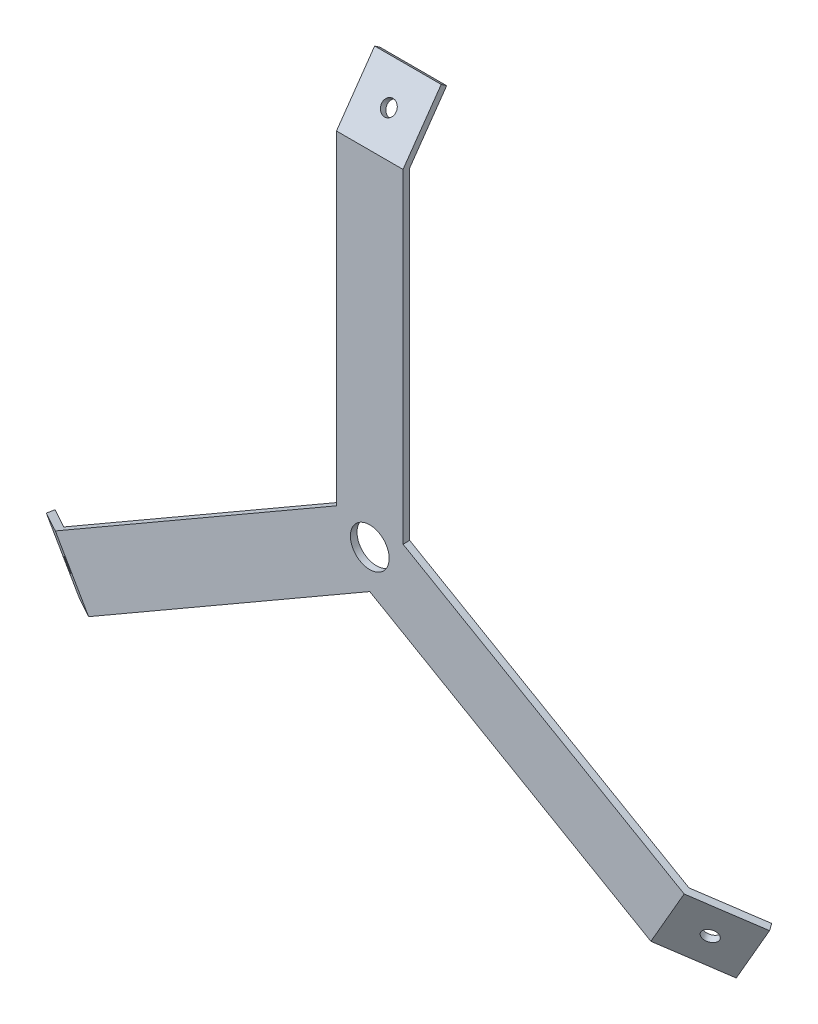
ISO-10303-21;
HEADER;
FILE_DESCRIPTION(('STEP AP214'),'2;1');
FILE_NAME('part.step','',(''),(''),'','','');
FILE_SCHEMA(('AUTOMOTIVE_DESIGN { 1 0 10303 214 1 1 1 1 }'));
ENDSEC;
DATA;
#1=APPLICATION_CONTEXT('core data for automotive mechanical design processes');
#2=APPLICATION_PROTOCOL_DEFINITION('international standard','automotive_design',2000,#1);
#3=PRODUCT_CONTEXT('',#1,'mechanical');
#4=PRODUCT('Part','Part','',(#3));
#5=PRODUCT_RELATED_PRODUCT_CATEGORY('part','',(#4));
#6=PRODUCT_DEFINITION_FORMATION('','',#4);
#7=PRODUCT_DEFINITION_CONTEXT('part definition',#1,'design');
#8=PRODUCT_DEFINITION('design','',#6,#7);
#9=PRODUCT_DEFINITION_SHAPE('','',#8);
#10=(LENGTH_UNIT() NAMED_UNIT(*) SI_UNIT(.MILLI.,.METRE.));
#11=(NAMED_UNIT(*) PLANE_ANGLE_UNIT() SI_UNIT($,.RADIAN.));
#12=(NAMED_UNIT(*) SI_UNIT($,.STERADIAN.) SOLID_ANGLE_UNIT());
#13=UNCERTAINTY_MEASURE_WITH_UNIT(LENGTH_MEASURE(1.E-05),#10,'distance_accuracy_value','');
#14=(GEOMETRIC_REPRESENTATION_CONTEXT(3) GLOBAL_UNCERTAINTY_ASSIGNED_CONTEXT((#13)) GLOBAL_UNIT_ASSIGNED_CONTEXT((#10,
#11,#12)) REPRESENTATION_CONTEXT('',''));
#15=CARTESIAN_POINT('',(0.,0.,0.));
#16=DIRECTION('',(0.,0.,1.));
#17=DIRECTION('',(1.,0.,0.));
#18=AXIS2_PLACEMENT_3D('',#15,#16,#17);
#19=CARTESIAN_POINT('',(-15.,0.,0.));
#20=DIRECTION('',(-1.,0.,0.));
#21=DIRECTION('',(0.,0.,1.));
#22=AXIS2_PLACEMENT_3D('',#19,#20,#21);
#23=PLANE('',#22);
#24=DIRECTION('',(0.,1.,0.));
#25=VECTOR('',#24,1.);
#26=CARTESIAN_POINT('',(-15.0000000000002,0.,-3.));
#27=LINE('',#26,#25);
#28=CARTESIAN_POINT('',(-15.0000000000002,8.66025403784447,-3.));
#29=VERTEX_POINT('',#28);
#30=CARTESIAN_POINT('',(-15.0000000000002,154.054103633363,-3.));
#31=VERTEX_POINT('',#30);
#32=EDGE_CURVE('E61',#29,#31,#27,.T.);
#33=ORIENTED_EDGE('',*,*,#32,.F.);
#34=DIRECTION('',(0.,0.,1.));
#35=VECTOR('',#34,1.);
#36=CARTESIAN_POINT('',(-15.,8.66025403784447,0.));
#37=LINE('',#36,#35);
#38=CARTESIAN_POINT('',(-15.,8.66025403784447,0.));
#39=VERTEX_POINT('',#38);
#40=EDGE_CURVE('E11',#29,#39,#37,.T.);
#41=ORIENTED_EDGE('',*,*,#40,.T.);
#42=DIRECTION('',(0.,1.,0.));
#43=VECTOR('',#42,1.);
#44=CARTESIAN_POINT('',(-15.,0.,0.));
#45=LINE('',#44,#43);
#46=CARTESIAN_POINT('',(-15.,155.,1.11022302462516E-13));
#47=VERTEX_POINT('',#46);
#48=EDGE_CURVE('E251',#39,#47,#45,.T.);
#49=ORIENTED_EDGE('',*,*,#48,.T.);
#50=DIRECTION('',(0.,0.819152044288991,-0.573576436351047));
#51=VECTOR('',#50,1.);
#52=CARTESIAN_POINT('',(-15.,155.,1.11022302462516E-13));
#53=LINE('',#52,#51);
#54=CARTESIAN_POINT('',(-15.0000000000002,179.57456132867,-17.2072930905314));
#55=VERTEX_POINT('',#54);
#56=EDGE_CURVE('E249',#47,#55,#53,.T.);
#57=ORIENTED_EDGE('',*,*,#56,.T.);
#58=DIRECTION('',(0.,-0.573576436351048,-0.81915204428899));
#59=VECTOR('',#58,1.);
#60=CARTESIAN_POINT('',(-15.0000000000002,179.57456132867,-17.2072930905314));
#61=LINE('',#60,#59);
#62=CARTESIAN_POINT('',(-15.0000000000002,177.853832019617,-19.6647492233983));
#63=VERTEX_POINT('',#62);
#64=EDGE_CURVE('E247',#55,#63,#61,.T.);
#65=ORIENTED_EDGE('',*,*,#64,.T.);
#66=DIRECTION('',(0.,0.819152044288991,-0.573576436351047));
#67=VECTOR('',#66,1.);
#68=CARTESIAN_POINT('',(-15.0000000000002,153.279270690947,-2.45745613286696));
#69=LINE('',#68,#67);
#70=EDGE_CURVE('E244',#31,#63,#69,.T.);
#71=ORIENTED_EDGE('',*,*,#70,.F.);
#72=EDGE_LOOP('',(#33,#41,#49,#57,#65,#71));
#73=FACE_BOUND('',#72,.T.);
#74=ADVANCED_FACE('F36',(#73),#23,.T.);
#75=CARTESIAN_POINT('',(-15.0000000000002,153.279270690947,-2.45745613286696));
#76=DIRECTION('',(0.,-0.573576436351047,-0.819152044288991));
#77=DIRECTION('',(0.,0.819152044288991,-0.573576436351047));
#78=AXIS2_PLACEMENT_3D('',#75,#76,#77);
#79=PLANE('',#78);
#80=CARTESIAN_POINT('',(0.,165.566551355282,-11.0611026781327));
#81=DIRECTION('',(0.,-0.573576436351047,-0.819152044288991));
#82=DIRECTION('',(0.,0.819152044288991,-0.573576436351047));
#83=AXIS2_PLACEMENT_3D('',#80,#81,#82);
#84=CIRCLE('',#83,3.3);
#85=CARTESIAN_POINT('',(0.,168.269753101435,-12.9539049180911));
#86=VERTEX_POINT('',#85);
#87=EDGE_CURVE('E266',#86,#86,#84,.T.);
#88=ORIENTED_EDGE('',*,*,#87,.F.);
#89=EDGE_LOOP('',(#88));
#90=FACE_BOUND('',#89,.T.);
#91=DIRECTION('',(1.,0.,0.));
#92=VECTOR('',#91,1.);
#93=CARTESIAN_POINT('',(-15.0000000000002,177.853832019617,-19.6647492233983));
#94=LINE('',#93,#92);
#95=CARTESIAN_POINT('',(14.9999999999998,177.853832019617,-19.6647492233983));
#96=VERTEX_POINT('',#95);
#97=EDGE_CURVE('E254',#63,#96,#94,.T.);
#98=ORIENTED_EDGE('',*,*,#97,.T.);
#99=DIRECTION('',(0.,0.819152044288991,-0.573576436351047));
#100=VECTOR('',#99,1.);
#101=CARTESIAN_POINT('',(14.9999999999998,153.279270690947,-2.45745613286696));
#102=LINE('',#101,#100);
#103=CARTESIAN_POINT('',(14.9999999999998,154.054103633363,-3.));
#104=VERTEX_POINT('',#103);
#105=EDGE_CURVE('E231',#104,#96,#102,.T.);
#106=ORIENTED_EDGE('',*,*,#105,.F.);
#107=DIRECTION('',(1.,0.,0.));
#108=VECTOR('',#107,1.);
#109=CARTESIAN_POINT('',(-15.0000000000002,154.054103633363,-3.));
#110=LINE('',#109,#108);
#111=EDGE_CURVE('E255',#31,#104,#110,.T.);
#112=ORIENTED_EDGE('',*,*,#111,.F.);
#113=ORIENTED_EDGE('',*,*,#70,.T.);
#114=EDGE_LOOP('',(#98,#106,#112,#113));
#115=FACE_BOUND('',#114,.T.);
#116=ADVANCED_FACE('F38',(#90,#115),#79,.T.);
#117=CARTESIAN_POINT('',(-15.0000000000002,0.,-3.));
#118=DIRECTION('',(0.,0.,-1.));
#119=DIRECTION('',(-1.,0.,0.));
#120=AXIS2_PLACEMENT_3D('',#117,#118,#119);
#121=PLANE('',#120);
#122=CARTESIAN_POINT('',(-1.66533453693773E-13,0.,-3.));
#123=DIRECTION('',(0.,0.,-1.));
#124=DIRECTION('',(-1.,0.,0.));
#125=AXIS2_PLACEMENT_3D('',#122,#123,#124);
#126=CIRCLE('',#125,8.75);
#127=CARTESIAN_POINT('',(-8.75000000000017,0.,-3.));
#128=VERTEX_POINT('',#127);
#129=EDGE_CURVE('E265',#128,#128,#126,.T.);
#130=ORIENTED_EDGE('',*,*,#129,.F.);
#131=EDGE_LOOP('',(#130));
#132=FACE_BOUND('',#131,.T.);
#133=DIRECTION('',(0.,1.,0.));
#134=VECTOR('',#133,1.);
#135=CARTESIAN_POINT('',(14.9999999999998,0.,-3.));
#136=LINE('',#135,#134);
#137=CARTESIAN_POINT('',(14.9999999999998,8.66025403784434,-3.));
#138=VERTEX_POINT('',#137);
#139=EDGE_CURVE('E242',#138,#104,#136,.T.);
#140=ORIENTED_EDGE('',*,*,#139,.F.);
#141=DIRECTION('',(0.866025403784436,-0.500000000000004,0.));
#142=VECTOR('',#141,1.);
#143=CARTESIAN_POINT('',(7.4999999999999,12.9903810567665,-3.00000000000022));
#144=LINE('',#143,#142);
#145=CARTESIAN_POINT('',(140.914767303733,-64.0366707599155,-3.));
#146=VERTEX_POINT('',#145);
#147=EDGE_CURVE('E53',#138,#146,#144,.T.);
#148=ORIENTED_EDGE('',*,*,#147,.T.);
#149=DIRECTION('',(-0.500000000000004,-0.866025403784436,0.));
#150=VECTOR('',#149,1.);
#151=CARTESIAN_POINT('',(140.914767303733,-64.0366707599155,-3.));
#152=LINE('',#151,#150);
#153=CARTESIAN_POINT('',(125.914767303732,-90.0174328734486,-3.));
#154=VERTEX_POINT('',#153);
#155=EDGE_CURVE('E219',#146,#154,#152,.T.);
#156=ORIENTED_EDGE('',*,*,#155,.T.);
#157=DIRECTION('',(0.866025403784436,-0.500000000000004,0.));
#158=VECTOR('',#157,1.);
#159=CARTESIAN_POINT('',(-7.50000000000023,-12.9903810567665,-3.));
#160=LINE('',#159,#158);
#161=CARTESIAN_POINT('',(-2.77555756156289E-13,-17.3205080756888,-3.));
#162=VERTEX_POINT('',#161);
#163=EDGE_CURVE('E206',#162,#154,#160,.T.);
#164=ORIENTED_EDGE('',*,*,#163,.F.);
#165=DIRECTION('',(-0.866025403784443,-0.499999999999992,0.));
#166=VECTOR('',#165,1.);
#167=CARTESIAN_POINT('',(7.49999999999973,-12.9903810567667,-3.));
#168=LINE('',#167,#166);
#169=CARTESIAN_POINT('',(-125.914767303734,-90.0174328734468,-3.));
#170=VERTEX_POINT('',#169);
#171=EDGE_CURVE('E159',#162,#170,#168,.T.);
#172=ORIENTED_EDGE('',*,*,#171,.T.);
#173=DIRECTION('',(-0.499999999999992,0.866025403784443,0.));
#174=VECTOR('',#173,1.);
#175=CARTESIAN_POINT('',(-125.914767303734,-90.0174328734468,-3.));
#176=LINE('',#175,#174);
#177=CARTESIAN_POINT('',(-140.914767303734,-64.0366707599135,-3.));
#178=VERTEX_POINT('',#177);
#179=EDGE_CURVE('E189',#170,#178,#176,.T.);
#180=ORIENTED_EDGE('',*,*,#179,.T.);
#181=DIRECTION('',(-0.866025403784443,-0.499999999999992,0.));
#182=VECTOR('',#181,1.);
#183=CARTESIAN_POINT('',(-7.50000000000006,12.9903810567666,-3.00000000000022));
#184=LINE('',#183,#182);
#185=EDGE_CURVE('E167',#29,#178,#184,.T.);
#186=ORIENTED_EDGE('',*,*,#185,.F.);
#187=ORIENTED_EDGE('',*,*,#32,.T.);
#188=ORIENTED_EDGE('',*,*,#111,.T.);
#189=EDGE_LOOP('',(#140,#148,#156,#164,#172,#180,#186,#187,#188));
#190=FACE_BOUND('',#189,.T.);
#191=ADVANCED_FACE('F293',(#132,#190),#121,.T.);
#192=CARTESIAN_POINT('',(-15.,0.,0.));
#193=DIRECTION('',(0.,0.,-1.));
#194=DIRECTION('',(-1.,0.,0.));
#195=AXIS2_PLACEMENT_3D('',#192,#193,#194);
#196=PLANE('',#195);
#197=CARTESIAN_POINT('',(0.,0.,0.));
#198=DIRECTION('',(0.,0.,-1.));
#199=DIRECTION('',(-1.,0.,0.));
#200=AXIS2_PLACEMENT_3D('',#197,#198,#199);
#201=CIRCLE('',#200,8.75);
#202=CARTESIAN_POINT('',(-8.75,0.,0.));
#203=VERTEX_POINT('',#202);
#204=EDGE_CURVE('E169',#203,#203,#201,.T.);
#205=ORIENTED_EDGE('',*,*,#204,.T.);
#206=EDGE_LOOP('',(#205));
#207=FACE_BOUND('',#206,.T.);
#208=DIRECTION('',(0.866025403784436,-0.500000000000004,0.));
#209=VECTOR('',#208,1.);
#210=CARTESIAN_POINT('',(7.50000000000006,12.9903810567665,-2.22044604925031E-13));
#211=LINE('',#210,#209);
#212=CARTESIAN_POINT('',(15.,8.66025403784434,0.));
#213=VERTEX_POINT('',#212);
#214=CARTESIAN_POINT('',(141.733937586588,-64.5096189432341,0.));
#215=VERTEX_POINT('',#214);
#216=EDGE_CURVE('E215',#213,#215,#211,.T.);
#217=ORIENTED_EDGE('',*,*,#216,.F.);
#218=DIRECTION('',(0.,1.,0.));
#219=VECTOR('',#218,1.);
#220=CARTESIAN_POINT('',(15.,0.,0.));
#221=LINE('',#220,#219);
#222=CARTESIAN_POINT('',(15.,155.,0.));
#223=VERTEX_POINT('',#222);
#224=EDGE_CURVE('E240',#213,#223,#221,.T.);
#225=ORIENTED_EDGE('',*,*,#224,.T.);
#226=DIRECTION('',(1.,0.,0.));
#227=VECTOR('',#226,1.);
#228=CARTESIAN_POINT('',(-15.,155.,1.11022302462516E-13));
#229=LINE('',#228,#227);
#230=EDGE_CURVE('E257',#47,#223,#229,.T.);
#231=ORIENTED_EDGE('',*,*,#230,.F.);
#232=ORIENTED_EDGE('',*,*,#48,.F.);
#233=DIRECTION('',(-0.866025403784443,-0.499999999999992,0.));
#234=VECTOR('',#233,1.);
#235=CARTESIAN_POINT('',(-7.4999999999999,12.9903810567666,-2.22044604925031E-13));
#236=LINE('',#235,#234);
#237=CARTESIAN_POINT('',(-141.733937586589,-64.5096189432321,0.));
#238=VERTEX_POINT('',#237);
#239=EDGE_CURVE('E175',#39,#238,#236,.T.);
#240=ORIENTED_EDGE('',*,*,#239,.T.);
#241=DIRECTION('',(-0.499999999999992,0.866025403784443,0.));
#242=VECTOR('',#241,1.);
#243=CARTESIAN_POINT('',(-126.733937586589,-90.4903810567654,0.));
#244=LINE('',#243,#242);
#245=CARTESIAN_POINT('',(-126.733937586589,-90.4903810567654,0.));
#246=VERTEX_POINT('',#245);
#247=EDGE_CURVE('E192',#246,#238,#244,.T.);
#248=ORIENTED_EDGE('',*,*,#247,.F.);
#249=DIRECTION('',(-0.866025403784443,-0.499999999999992,0.));
#250=VECTOR('',#249,1.);
#251=CARTESIAN_POINT('',(7.4999999999999,-12.9903810567667,0.));
#252=LINE('',#251,#250);
#253=CARTESIAN_POINT('',(-1.11022302462516E-13,-17.3205080756887,0.));
#254=VERTEX_POINT('',#253);
#255=EDGE_CURVE('E186',#254,#246,#252,.T.);
#256=ORIENTED_EDGE('',*,*,#255,.F.);
#257=DIRECTION('',(0.866025403784436,-0.500000000000004,0.));
#258=VECTOR('',#257,1.);
#259=CARTESIAN_POINT('',(-7.50000000000006,-12.9903810567665,0.));
#260=LINE('',#259,#258);
#261=CARTESIAN_POINT('',(126.733937586588,-90.4903810567672,0.));
#262=VERTEX_POINT('',#261);
#263=EDGE_CURVE('E204',#254,#262,#260,.T.);
#264=ORIENTED_EDGE('',*,*,#263,.T.);
#265=DIRECTION('',(-0.500000000000004,-0.866025403784436,0.));
#266=VECTOR('',#265,1.);
#267=CARTESIAN_POINT('',(141.733937586588,-64.5096189432341,0.));
#268=LINE('',#267,#266);
#269=EDGE_CURVE('E223',#215,#262,#268,.T.);
#270=ORIENTED_EDGE('',*,*,#269,.F.);
#271=EDGE_LOOP('',(#217,#225,#231,#232,#240,#248,#256,#264,#270));
#272=FACE_BOUND('',#271,.T.);
#273=ADVANCED_FACE('F283',(#207,#272),#196,.F.);
#274=CARTESIAN_POINT('',(-15.,155.,1.11022302462516E-13));
#275=DIRECTION('',(0.,-0.573576436351047,-0.819152044288991));
#276=DIRECTION('',(0.,0.819152044288991,-0.573576436351047));
#277=AXIS2_PLACEMENT_3D('',#274,#275,#276);
#278=PLANE('',#277);
#279=CARTESIAN_POINT('',(0.,167.287280664335,-8.6036465452658));
#280=DIRECTION('',(0.,-0.573576436351047,-0.819152044288991));
#281=DIRECTION('',(0.,0.819152044288991,-0.573576436351047));
#282=AXIS2_PLACEMENT_3D('',#279,#280,#281);
#283=CIRCLE('',#282,3.3);
#284=CARTESIAN_POINT('',(0.,169.990482410489,-10.4964487852243));
#285=VERTEX_POINT('',#284);
#286=EDGE_CURVE('E263',#285,#285,#283,.T.);
#287=ORIENTED_EDGE('',*,*,#286,.T.);
#288=EDGE_LOOP('',(#287));
#289=FACE_BOUND('',#288,.T.);
#290=ORIENTED_EDGE('',*,*,#230,.T.);
#291=DIRECTION('',(0.,0.819152044288991,-0.573576436351047));
#292=VECTOR('',#291,1.);
#293=CARTESIAN_POINT('',(15.,155.,0.));
#294=LINE('',#293,#292);
#295=CARTESIAN_POINT('',(14.9999999999998,179.57456132867,-17.2072930905314));
#296=VERTEX_POINT('',#295);
#297=EDGE_CURVE('E237',#223,#296,#294,.T.);
#298=ORIENTED_EDGE('',*,*,#297,.T.);
#299=DIRECTION('',(1.,0.,0.));
#300=VECTOR('',#299,1.);
#301=CARTESIAN_POINT('',(-15.0000000000002,179.57456132867,-17.2072930905314));
#302=LINE('',#301,#300);
#303=EDGE_CURVE('E260',#55,#296,#302,.T.);
#304=ORIENTED_EDGE('',*,*,#303,.F.);
#305=ORIENTED_EDGE('',*,*,#56,.F.);
#306=EDGE_LOOP('',(#290,#298,#304,#305));
#307=FACE_BOUND('',#306,.T.);
#308=ADVANCED_FACE('F338',(#289,#307),#278,.F.);
#309=CARTESIAN_POINT('',(-15.0000000000002,179.57456132867,-17.2072930905314));
#310=DIRECTION('',(0.,-0.81915204428899,0.573576436351048));
#311=DIRECTION('',(0.,-0.573576436351048,-0.81915204428899));
#312=AXIS2_PLACEMENT_3D('',#309,#310,#311);
#313=PLANE('',#312);
#314=ORIENTED_EDGE('',*,*,#303,.T.);
#315=DIRECTION('',(0.,-0.573576436351048,-0.81915204428899));
#316=VECTOR('',#315,1.);
#317=CARTESIAN_POINT('',(14.9999999999998,179.57456132867,-17.2072930905314));
#318=LINE('',#317,#316);
#319=EDGE_CURVE('E234',#296,#96,#318,.T.);
#320=ORIENTED_EDGE('',*,*,#319,.T.);
#321=ORIENTED_EDGE('',*,*,#97,.F.);
#322=ORIENTED_EDGE('',*,*,#64,.F.);
#323=EDGE_LOOP('',(#314,#320,#321,#322));
#324=FACE_BOUND('',#323,.T.);
#325=ADVANCED_FACE('F342',(#324),#313,.F.);
#326=CARTESIAN_POINT('',(15.,0.,0.));
#327=DIRECTION('',(-1.,0.,0.));
#328=DIRECTION('',(0.,0.,1.));
#329=AXIS2_PLACEMENT_3D('',#326,#327,#328);
#330=PLANE('',#329);
#331=ORIENTED_EDGE('',*,*,#224,.F.);
#332=DIRECTION('',(0.,0.,-1.));
#333=VECTOR('',#332,1.);
#334=CARTESIAN_POINT('',(15.,8.66025403784434,0.));
#335=LINE('',#334,#333);
#336=EDGE_CURVE('E45',#213,#138,#335,.T.);
#337=ORIENTED_EDGE('',*,*,#336,.T.);
#338=ORIENTED_EDGE('',*,*,#139,.T.);
#339=ORIENTED_EDGE('',*,*,#105,.T.);
#340=ORIENTED_EDGE('',*,*,#319,.F.);
#341=ORIENTED_EDGE('',*,*,#297,.F.);
#342=EDGE_LOOP('',(#331,#337,#338,#339,#340,#341));
#343=FACE_BOUND('',#342,.T.);
#344=ADVANCED_FACE('F301',(#343),#330,.F.);
#345=CARTESIAN_POINT('',(7.50000000000006,12.9903810567665,-2.22044604925031E-13));
#346=DIRECTION('',(0.500000000000004,0.866025403784436,0.));
#347=DIRECTION('',(0.,0.,1.));
#348=AXIS2_PLACEMENT_3D('',#345,#346,#347);
#349=PLANE('',#348);
#350=ORIENTED_EDGE('',*,*,#336,.F.);
#351=ORIENTED_EDGE('',*,*,#216,.T.);
#352=DIRECTION('',(0.70940647991622,-0.409576022144499,-0.573576436351047));
#353=VECTOR('',#352,1.);
#354=CARTESIAN_POINT('',(141.733937586588,-64.5096189432341,0.));
#355=LINE('',#354,#353);
#356=CARTESIAN_POINT('',(163.016131984074,-76.7968996075689,-17.2072930905312));
#357=VERTEX_POINT('',#356);
#358=EDGE_CURVE('E213',#215,#357,#355,.T.);
#359=ORIENTED_EDGE('',*,*,#358,.T.);
#360=DIRECTION('',(-0.496731764892155,0.286788218175527,-0.81915204428899));
#361=VECTOR('',#360,1.);
#362=CARTESIAN_POINT('',(163.016131984074,-76.7968996075689,-17.2072930905312));
#363=LINE('',#362,#361);
#364=CARTESIAN_POINT('',(161.525936689398,-75.9365349530424,-19.6647492233981));
#365=VERTEX_POINT('',#364);
#366=EDGE_CURVE('E211',#357,#365,#363,.T.);
#367=ORIENTED_EDGE('',*,*,#366,.T.);
#368=DIRECTION('',(0.70940647991622,-0.409576022144499,-0.573576436351047));
#369=VECTOR('',#368,1.);
#370=CARTESIAN_POINT('',(140.243742291911,-63.6492542887075,-2.45745613286696));
#371=LINE('',#370,#369);
#372=EDGE_CURVE('E208',#146,#365,#371,.T.);
#373=ORIENTED_EDGE('',*,*,#372,.F.);
#374=ORIENTED_EDGE('',*,*,#147,.F.);
#375=EDGE_LOOP('',(#350,#351,#359,#367,#373,#374));
#376=FACE_BOUND('',#375,.T.);
#377=ADVANCED_FACE('F305',(#376),#349,.T.);
#378=CARTESIAN_POINT('',(140.243742291911,-63.6492542887075,-2.45745613286696));
#379=DIRECTION('',(-0.496731764892154,0.286788218175526,-0.819152044288991));
#380=DIRECTION('',(-0.855070113272874,0.,0.518512392703891));
#381=AXIS2_PLACEMENT_3D('',#378,#379,#380);
#382=PLANE('',#381);
#383=CARTESIAN_POINT('',(143.384839490654,-82.7832756776414,-11.0611026781328));
#384=DIRECTION('',(-0.496731764892154,0.286788218175526,-0.819152044288991));
#385=DIRECTION('',(-0.855070113272874,0.,0.518512392703891));
#386=AXIS2_PLACEMENT_3D('',#383,#384,#385);
#387=CIRCLE('',#386,3.30000000000001);
#388=CARTESIAN_POINT('',(140.563108116854,-82.7832756776414,-9.35001178220992));
#389=VERTEX_POINT('',#388);
#390=EDGE_CURVE('E277',#389,#389,#387,.T.);
#391=ORIENTED_EDGE('',*,*,#390,.F.);
#392=EDGE_LOOP('',(#391));
#393=FACE_BOUND('',#392,.T.);
#394=DIRECTION('',(-0.500000000000004,-0.866025403784436,0.));
#395=VECTOR('',#394,1.);
#396=CARTESIAN_POINT('',(161.525936689398,-75.9365349530424,-19.6647492233981));
#397=LINE('',#396,#395);
#398=CARTESIAN_POINT('',(146.525936689398,-101.917297066575,-19.6647492233984));
#399=VERTEX_POINT('',#398);
#400=EDGE_CURVE('E218',#365,#399,#397,.T.);
#401=ORIENTED_EDGE('',*,*,#400,.T.);
#402=DIRECTION('',(0.70940647991622,-0.409576022144499,-0.573576436351047));
#403=VECTOR('',#402,1.);
#404=CARTESIAN_POINT('',(125.243742291911,-89.6300164022406,-2.45745613286696));
#405=LINE('',#404,#403);
#406=EDGE_CURVE('E191',#154,#399,#405,.T.);
#407=ORIENTED_EDGE('',*,*,#406,.F.);
#408=ORIENTED_EDGE('',*,*,#155,.F.);
#409=ORIENTED_EDGE('',*,*,#372,.T.);
#410=EDGE_LOOP('',(#401,#407,#408,#409));
#411=FACE_BOUND('',#410,.T.);
#412=ADVANCED_FACE('F322',(#393,#411),#382,.T.);
#413=CARTESIAN_POINT('',(141.733937586588,-64.5096189432341,0.));
#414=DIRECTION('',(-0.496731764892154,0.286788218175526,-0.819152044288991));
#415=DIRECTION('',(-0.855070113272874,0.,0.518512392703891));
#416=AXIS2_PLACEMENT_3D('',#413,#414,#415);
#417=PLANE('',#416);
#418=CARTESIAN_POINT('',(144.875034785331,-83.6436403321681,-8.60364654526558));
#419=DIRECTION('',(-0.496731764892154,0.286788218175526,-0.819152044288991));
#420=DIRECTION('',(-0.855070113272874,0.,0.518512392703891));
#421=AXIS2_PLACEMENT_3D('',#418,#419,#420);
#422=CIRCLE('',#421,3.3);
#423=CARTESIAN_POINT('',(142.05330341153,-83.6436403321681,-6.89255564934273));
#424=VERTEX_POINT('',#423);
#425=EDGE_CURVE('E272',#424,#424,#422,.T.);
#426=ORIENTED_EDGE('',*,*,#425,.T.);
#427=EDGE_LOOP('',(#426));
#428=FACE_BOUND('',#427,.T.);
#429=ORIENTED_EDGE('',*,*,#269,.T.);
#430=DIRECTION('',(0.70940647991622,-0.409576022144499,-0.573576436351047));
#431=VECTOR('',#430,1.);
#432=CARTESIAN_POINT('',(126.733937586588,-90.4903810567672,0.));
#433=LINE('',#432,#431);
#434=CARTESIAN_POINT('',(148.016131984074,-102.777661721102,-17.2072930905315));
#435=VERTEX_POINT('',#434);
#436=EDGE_CURVE('E201',#262,#435,#433,.T.);
#437=ORIENTED_EDGE('',*,*,#436,.T.);
#438=DIRECTION('',(-0.500000000000004,-0.866025403784436,0.));
#439=VECTOR('',#438,1.);
#440=CARTESIAN_POINT('',(163.016131984074,-76.7968996075689,-17.2072930905312));
#441=LINE('',#440,#439);
#442=EDGE_CURVE('E226',#357,#435,#441,.T.);
#443=ORIENTED_EDGE('',*,*,#442,.F.);
#444=ORIENTED_EDGE('',*,*,#358,.F.);
#445=EDGE_LOOP('',(#429,#437,#443,#444));
#446=FACE_BOUND('',#445,.T.);
#447=ADVANCED_FACE('F314',(#428,#446),#417,.F.);
#448=CARTESIAN_POINT('',(163.016131984074,-76.7968996075689,-17.2072930905312));
#449=DIRECTION('',(-0.709406479916219,0.409576022144498,0.573576436351048));
#450=DIRECTION('',(0.628731263987389,0.,0.777622657646252));
#451=AXIS2_PLACEMENT_3D('',#448,#449,#450);
#452=PLANE('',#451);
#453=ORIENTED_EDGE('',*,*,#442,.T.);
#454=DIRECTION('',(-0.496731764892155,0.286788218175527,-0.81915204428899));
#455=VECTOR('',#454,1.);
#456=CARTESIAN_POINT('',(148.016131984074,-102.777661721102,-17.2072930905315));
#457=LINE('',#456,#455);
#458=EDGE_CURVE('E198',#435,#399,#457,.T.);
#459=ORIENTED_EDGE('',*,*,#458,.T.);
#460=ORIENTED_EDGE('',*,*,#400,.F.);
#461=ORIENTED_EDGE('',*,*,#366,.F.);
#462=EDGE_LOOP('',(#453,#459,#460,#461));
#463=FACE_BOUND('',#462,.T.);
#464=ADVANCED_FACE('F318',(#463),#452,.F.);
#465=CARTESIAN_POINT('',(-7.50000000000006,-12.9903810567665,0.));
#466=DIRECTION('',(0.500000000000004,0.866025403784436,0.));
#467=DIRECTION('',(0.,0.,1.));
#468=AXIS2_PLACEMENT_3D('',#465,#466,#467);
#469=PLANE('',#468);
#470=ORIENTED_EDGE('',*,*,#263,.F.);
#471=DIRECTION('',(0.,0.,-1.));
#472=VECTOR('',#471,1.);
#473=CARTESIAN_POINT('',(-1.11022302462516E-13,-17.3205080756887,0.));
#474=LINE('',#473,#472);
#475=EDGE_CURVE('E222',#254,#162,#474,.T.);
#476=ORIENTED_EDGE('',*,*,#475,.T.);
#477=ORIENTED_EDGE('',*,*,#163,.T.);
#478=ORIENTED_EDGE('',*,*,#406,.T.);
#479=ORIENTED_EDGE('',*,*,#458,.F.);
#480=ORIENTED_EDGE('',*,*,#436,.F.);
#481=EDGE_LOOP('',(#470,#476,#477,#478,#479,#480));
#482=FACE_BOUND('',#481,.T.);
#483=ADVANCED_FACE('F325',(#482),#469,.F.);
#484=CARTESIAN_POINT('',(7.4999999999999,-12.9903810567667,0.));
#485=DIRECTION('',(0.499999999999992,-0.866025403784443,0.));
#486=DIRECTION('',(0.,0.,1.));
#487=AXIS2_PLACEMENT_3D('',#484,#485,#486);
#488=PLANE('',#487);
#489=ORIENTED_EDGE('',*,*,#475,.F.);
#490=ORIENTED_EDGE('',*,*,#255,.T.);
#491=DIRECTION('',(-0.709406479916226,-0.409576022144489,-0.573576436351047));
#492=VECTOR('',#491,1.);
#493=CARTESIAN_POINT('',(-126.733937586589,-90.4903810567654,0.));
#494=LINE('',#493,#492);
#495=CARTESIAN_POINT('',(-148.016131984076,-102.7776617211,-17.2072930905315));
#496=VERTEX_POINT('',#495);
#497=EDGE_CURVE('E184',#246,#496,#494,.T.);
#498=ORIENTED_EDGE('',*,*,#497,.T.);
#499=DIRECTION('',(0.496731764892159,0.28678821817552,-0.81915204428899));
#500=VECTOR('',#499,1.);
#501=CARTESIAN_POINT('',(-148.016131984076,-102.7776617211,-17.2072930905315));
#502=LINE('',#501,#500);
#503=CARTESIAN_POINT('',(-146.525936689399,-101.917297066573,-19.6647492233984));
#504=VERTEX_POINT('',#503);
#505=EDGE_CURVE('E182',#496,#504,#502,.T.);
#506=ORIENTED_EDGE('',*,*,#505,.T.);
#507=DIRECTION('',(-0.709406479916226,-0.409576022144489,-0.573576436351047));
#508=VECTOR('',#507,1.);
#509=CARTESIAN_POINT('',(-125.243742291912,-89.6300164022388,-2.45745613286696));
#510=LINE('',#509,#508);
#511=EDGE_CURVE('E154',#170,#504,#510,.T.);
#512=ORIENTED_EDGE('',*,*,#511,.F.);
#513=ORIENTED_EDGE('',*,*,#171,.F.);
#514=EDGE_LOOP('',(#489,#490,#498,#506,#512,#513));
#515=FACE_BOUND('',#514,.T.);
#516=ADVANCED_FACE('F327',(#515),#488,.T.);
#517=CARTESIAN_POINT('',(-125.243742291912,-89.6300164022388,-2.45745613286696));
#518=DIRECTION('',(0.496731764892158,0.286788218175519,-0.819152044288991));
#519=DIRECTION('',(-0.855070113272872,0.,-0.518512392703894));
#520=AXIS2_PLACEMENT_3D('',#517,#518,#519);
#521=PLANE('',#520);
#522=CARTESIAN_POINT('',(-143.384839490656,-82.7832756776394,-11.0611026781328));
#523=DIRECTION('',(0.496731764892158,0.286788218175519,-0.819152044288991));
#524=DIRECTION('',(-0.855070113272872,0.,-0.518512392703894));
#525=AXIS2_PLACEMENT_3D('',#522,#523,#524);
#526=CIRCLE('',#525,3.3);
#527=CARTESIAN_POINT('',(-146.206570864456,-82.7832756776394,-12.7721935740556));
#528=VERTEX_POINT('',#527);
#529=EDGE_CURVE('E430',#528,#528,#526,.T.);
#530=ORIENTED_EDGE('',*,*,#529,.F.);
#531=EDGE_LOOP('',(#530));
#532=FACE_BOUND('',#531,.T.);
#533=DIRECTION('',(-0.499999999999992,0.866025403784443,0.));
#534=VECTOR('',#533,1.);
#535=CARTESIAN_POINT('',(-146.525936689399,-101.917297066573,-19.6647492233984));
#536=LINE('',#535,#534);
#537=CARTESIAN_POINT('',(-161.525936689399,-75.9365349530401,-19.6647492233983));
#538=VERTEX_POINT('',#537);
#539=EDGE_CURVE('E148',#504,#538,#536,.T.);
#540=ORIENTED_EDGE('',*,*,#539,.T.);
#541=DIRECTION('',(-0.709406479916226,-0.409576022144489,-0.573576436351047));
#542=VECTOR('',#541,1.);
#543=CARTESIAN_POINT('',(-140.243742291912,-63.6492542887055,-2.45745613286696));
#544=LINE('',#543,#542);
#545=EDGE_CURVE('E152',#178,#538,#544,.T.);
#546=ORIENTED_EDGE('',*,*,#545,.F.);
#547=ORIENTED_EDGE('',*,*,#179,.F.);
#548=ORIENTED_EDGE('',*,*,#511,.T.);
#549=EDGE_LOOP('',(#540,#546,#547,#548));
#550=FACE_BOUND('',#549,.T.);
#551=ADVANCED_FACE('F150',(#532,#550),#521,.T.);
#552=CARTESIAN_POINT('',(-126.733937586589,-90.4903810567654,0.));
#553=DIRECTION('',(0.496731764892158,0.286788218175519,-0.819152044288991));
#554=DIRECTION('',(-0.855070113272872,0.,-0.518512392703894));
#555=AXIS2_PLACEMENT_3D('',#552,#553,#554);
#556=PLANE('',#555);
#557=CARTESIAN_POINT('',(-144.875034785332,-83.6436403321661,-8.60364654526569));
#558=DIRECTION('',(0.496731764892158,0.286788218175519,-0.819152044288991));
#559=DIRECTION('',(-0.855070113272872,0.,-0.518512392703894));
#560=AXIS2_PLACEMENT_3D('',#557,#558,#559);
#561=CIRCLE('',#560,3.3);
#562=CARTESIAN_POINT('',(-147.696766159133,-83.6436403321661,-10.3147374411885));
#563=VERTEX_POINT('',#562);
#564=EDGE_CURVE('E40',#563,#563,#561,.T.);
#565=ORIENTED_EDGE('',*,*,#564,.T.);
#566=EDGE_LOOP('',(#565));
#567=FACE_BOUND('',#566,.T.);
#568=ORIENTED_EDGE('',*,*,#247,.T.);
#569=DIRECTION('',(-0.709406479916226,-0.409576022144489,-0.573576436351047));
#570=VECTOR('',#569,1.);
#571=CARTESIAN_POINT('',(-141.733937586589,-64.5096189432321,0.));
#572=LINE('',#571,#570);
#573=CARTESIAN_POINT('',(-163.016131984075,-76.7968996075667,-17.2072930905314));
#574=VERTEX_POINT('',#573);
#575=EDGE_CURVE('E173',#238,#574,#572,.T.);
#576=ORIENTED_EDGE('',*,*,#575,.T.);
#577=DIRECTION('',(-0.499999999999992,0.866025403784443,0.));
#578=VECTOR('',#577,1.);
#579=CARTESIAN_POINT('',(-148.016131984076,-102.7776617211,-17.2072930905315));
#580=LINE('',#579,#578);
#581=EDGE_CURVE('E158',#496,#574,#580,.T.);
#582=ORIENTED_EDGE('',*,*,#581,.F.);
#583=ORIENTED_EDGE('',*,*,#497,.F.);
#584=EDGE_LOOP('',(#568,#576,#582,#583));
#585=FACE_BOUND('',#584,.T.);
#586=ADVANCED_FACE('F332',(#567,#585),#556,.F.);
#587=CARTESIAN_POINT('',(-148.016131984076,-102.7776617211,-17.2072930905315));
#588=DIRECTION('',(0.709406479916225,0.409576022144488,0.573576436351048));
#589=DIRECTION('',(0.628731263987386,0.,-0.777622657646255));
#590=AXIS2_PLACEMENT_3D('',#587,#588,#589);
#591=PLANE('',#590);
#592=ORIENTED_EDGE('',*,*,#581,.T.);
#593=DIRECTION('',(0.496731764892159,0.28678821817552,-0.81915204428899));
#594=VECTOR('',#593,1.);
#595=CARTESIAN_POINT('',(-163.016131984075,-76.7968996075667,-17.2072930905314));
#596=LINE('',#595,#594);
#597=EDGE_CURVE('E165',#574,#538,#596,.T.);
#598=ORIENTED_EDGE('',*,*,#597,.T.);
#599=ORIENTED_EDGE('',*,*,#539,.F.);
#600=ORIENTED_EDGE('',*,*,#505,.F.);
#601=EDGE_LOOP('',(#592,#598,#599,#600));
#602=FACE_BOUND('',#601,.T.);
#603=ADVANCED_FACE('F171',(#602),#591,.F.);
#604=CARTESIAN_POINT('',(-7.4999999999999,12.9903810567666,-2.22044604925031E-13));
#605=DIRECTION('',(0.499999999999992,-0.866025403784443,0.));
#606=DIRECTION('',(0.,0.,1.));
#607=AXIS2_PLACEMENT_3D('',#604,#605,#606);
#608=PLANE('',#607);
#609=ORIENTED_EDGE('',*,*,#40,.F.);
#610=ORIENTED_EDGE('',*,*,#185,.T.);
#611=ORIENTED_EDGE('',*,*,#545,.T.);
#612=ORIENTED_EDGE('',*,*,#597,.F.);
#613=ORIENTED_EDGE('',*,*,#575,.F.);
#614=ORIENTED_EDGE('',*,*,#239,.F.);
#615=EDGE_LOOP('',(#609,#610,#611,#612,#613,#614));
#616=FACE_BOUND('',#615,.T.);
#617=ADVANCED_FACE('F163',(#616),#608,.F.);
#618=CARTESIAN_POINT('',(-1.66533453693773E-13,0.,-3.));
#619=DIRECTION('',(0.,0.,-1.));
#620=DIRECTION('',(-1.,0.,0.));
#621=AXIS2_PLACEMENT_3D('',#618,#619,#620);
#622=CYLINDRICAL_SURFACE('',#621,8.75);
#623=ORIENTED_EDGE('',*,*,#204,.F.);
#624=EDGE_LOOP('',(#623));
#625=FACE_BOUND('',#624,.T.);
#626=ORIENTED_EDGE('',*,*,#129,.T.);
#627=EDGE_LOOP('',(#626));
#628=FACE_BOUND('',#627,.T.);
#629=ADVANCED_FACE('F286',(#625,#628),#622,.F.);
#630=CARTESIAN_POINT('',(0.,165.566551355282,-11.0611026781327));
#631=DIRECTION('',(0.,-0.573576436351047,-0.819152044288991));
#632=DIRECTION('',(0.,0.819152044288991,-0.573576436351047));
#633=AXIS2_PLACEMENT_3D('',#630,#631,#632);
#634=CYLINDRICAL_SURFACE('',#633,3.3);
#635=ORIENTED_EDGE('',*,*,#87,.T.);
#636=EDGE_LOOP('',(#635));
#637=FACE_BOUND('',#636,.T.);
#638=ORIENTED_EDGE('',*,*,#286,.F.);
#639=EDGE_LOOP('',(#638));
#640=FACE_BOUND('',#639,.T.);
#641=ADVANCED_FACE('F289',(#637,#640),#634,.F.);
#642=CARTESIAN_POINT('',(143.384839490654,-82.7832756776414,-11.0611026781328));
#643=DIRECTION('',(-0.496731764892154,0.286788218175526,-0.819152044288991));
#644=DIRECTION('',(-0.855070113272874,0.,0.518512392703891));
#645=AXIS2_PLACEMENT_3D('',#642,#643,#644);
#646=CYLINDRICAL_SURFACE('',#645,3.3);
#647=ORIENTED_EDGE('',*,*,#390,.T.);
#648=EDGE_LOOP('',(#647));
#649=FACE_BOUND('',#648,.T.);
#650=ORIENTED_EDGE('',*,*,#425,.F.);
#651=EDGE_LOOP('',(#650));
#652=FACE_BOUND('',#651,.T.);
#653=ADVANCED_FACE('F409',(#649,#652),#646,.F.);
#654=CARTESIAN_POINT('',(-143.384839490656,-82.7832756776394,-11.0611026781328));
#655=DIRECTION('',(0.496731764892158,0.286788218175519,-0.819152044288991));
#656=DIRECTION('',(-0.855070113272872,0.,-0.518512392703894));
#657=AXIS2_PLACEMENT_3D('',#654,#655,#656);
#658=CYLINDRICAL_SURFACE('',#657,3.3);
#659=ORIENTED_EDGE('',*,*,#529,.T.);
#660=EDGE_LOOP('',(#659));
#661=FACE_BOUND('',#660,.T.);
#662=ORIENTED_EDGE('',*,*,#564,.F.);
#663=EDGE_LOOP('',(#662));
#664=FACE_BOUND('',#663,.T.);
#665=ADVANCED_FACE('F416',(#661,#664),#658,.F.);
#666=CLOSED_SHELL('',(#74,#116,#191,#273,#308,#325,#344,#377,#412,#447,#464,#483,#516,#551,#586,
#603,#617,#629,#641,#653,#665));
#667=MANIFOLD_SOLID_BREP('B2',#666);
#668=ADVANCED_BREP_SHAPE_REPRESENTATION('',(#18,#667),#14);
#669=SHAPE_DEFINITION_REPRESENTATION(#9,#668);
ENDSEC;
END-ISO-10303-21;
